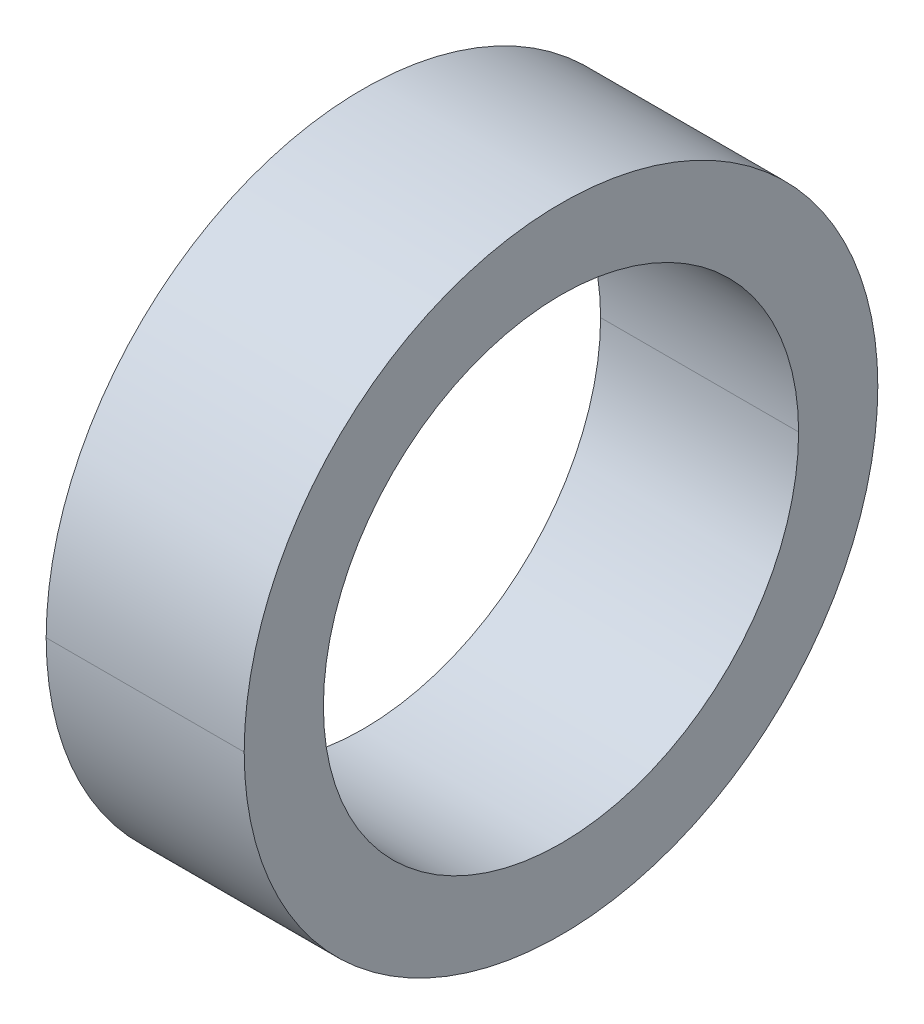
ISO-10303-21;
HEADER;
FILE_DESCRIPTION(('STEP AP214'),'2;1');
FILE_NAME('part.step','',(''),(''),'','','');
FILE_SCHEMA(('AUTOMOTIVE_DESIGN { 1 0 10303 214 1 1 1 1 }'));
ENDSEC;
DATA;
#1=APPLICATION_CONTEXT('core data for automotive mechanical design processes');
#2=APPLICATION_PROTOCOL_DEFINITION('international standard','automotive_design',2000,#1);
#3=PRODUCT_CONTEXT('',#1,'mechanical');
#4=PRODUCT('Part','Part','',(#3));
#5=PRODUCT_RELATED_PRODUCT_CATEGORY('part','',(#4));
#6=PRODUCT_DEFINITION_FORMATION('','',#4);
#7=PRODUCT_DEFINITION_CONTEXT('part definition',#1,'design');
#8=PRODUCT_DEFINITION('design','',#6,#7);
#9=PRODUCT_DEFINITION_SHAPE('','',#8);
#10=(LENGTH_UNIT() NAMED_UNIT(*) SI_UNIT(.MILLI.,.METRE.));
#11=(NAMED_UNIT(*) PLANE_ANGLE_UNIT() SI_UNIT($,.RADIAN.));
#12=(NAMED_UNIT(*) SI_UNIT($,.STERADIAN.) SOLID_ANGLE_UNIT());
#13=UNCERTAINTY_MEASURE_WITH_UNIT(LENGTH_MEASURE(1.E-05),#10,'distance_accuracy_value','');
#14=(GEOMETRIC_REPRESENTATION_CONTEXT(3) GLOBAL_UNCERTAINTY_ASSIGNED_CONTEXT((#13)) GLOBAL_UNIT_ASSIGNED_CONTEXT((#10,
#11,#12)) REPRESENTATION_CONTEXT('',''));
#15=CARTESIAN_POINT('',(0.,0.,0.));
#16=DIRECTION('',(0.,0.,1.));
#17=DIRECTION('',(1.,0.,0.));
#18=AXIS2_PLACEMENT_3D('',#15,#16,#17);
#19=CARTESIAN_POINT('',(1.25,0.,0.));
#20=DIRECTION('',(-1.,0.,0.));
#21=DIRECTION('',(0.,0.,1.));
#22=AXIS2_PLACEMENT_3D('',#19,#20,#21);
#23=CYLINDRICAL_SURFACE('',#22,3.);
#24=DIRECTION('',(-1.,0.,0.));
#25=VECTOR('',#24,1.);
#26=CARTESIAN_POINT('',(1.25,0.,-3.));
#27=LINE('',#26,#25);
#28=CARTESIAN_POINT('',(1.25,0.,-3.));
#29=VERTEX_POINT('',#28);
#30=CARTESIAN_POINT('',(-1.25,0.,-3.));
#31=VERTEX_POINT('',#30);
#32=EDGE_CURVE('E87',#29,#31,#27,.T.);
#33=ORIENTED_EDGE('',*,*,#32,.F.);
#34=CARTESIAN_POINT('',(1.25,0.,0.));
#35=DIRECTION('',(1.,0.,0.));
#36=DIRECTION('',(0.,0.,-1.));
#37=AXIS2_PLACEMENT_3D('',#34,#35,#36);
#38=CIRCLE('',#37,3.);
#39=CARTESIAN_POINT('',(1.25,0.,3.));
#40=VERTEX_POINT('',#39);
#41=EDGE_CURVE('E80',#29,#40,#38,.T.);
#42=ORIENTED_EDGE('',*,*,#41,.T.);
#43=DIRECTION('',(-1.,0.,0.));
#44=VECTOR('',#43,1.);
#45=CARTESIAN_POINT('',(1.25,0.,3.));
#46=LINE('',#45,#44);
#47=CARTESIAN_POINT('',(-1.25,0.,3.));
#48=VERTEX_POINT('',#47);
#49=EDGE_CURVE('E79',#40,#48,#46,.T.);
#50=ORIENTED_EDGE('',*,*,#49,.T.);
#51=CARTESIAN_POINT('',(-1.25,0.,0.));
#52=DIRECTION('',(1.,0.,0.));
#53=DIRECTION('',(0.,0.,-1.));
#54=AXIS2_PLACEMENT_3D('',#51,#52,#53);
#55=CIRCLE('',#54,3.);
#56=EDGE_CURVE('E11',#31,#48,#55,.T.);
#57=ORIENTED_EDGE('',*,*,#56,.F.);
#58=EDGE_LOOP('',(#33,#42,#50,#57));
#59=FACE_BOUND('',#58,.T.);
#60=ADVANCED_FACE('F16',(#59),#23,.F.);
#61=CARTESIAN_POINT('',(1.25,0.,0.));
#62=DIRECTION('',(-1.,0.,0.));
#63=DIRECTION('',(0.,0.,1.));
#64=AXIS2_PLACEMENT_3D('',#61,#62,#63);
#65=CYLINDRICAL_SURFACE('',#64,4.);
#66=DIRECTION('',(-1.,0.,0.));
#67=VECTOR('',#66,1.);
#68=CARTESIAN_POINT('',(1.25,0.,-4.));
#69=LINE('',#68,#67);
#70=CARTESIAN_POINT('',(1.25,0.,-4.));
#71=VERTEX_POINT('',#70);
#72=CARTESIAN_POINT('',(-1.25,0.,-4.));
#73=VERTEX_POINT('',#72);
#74=EDGE_CURVE('E102',#71,#73,#69,.T.);
#75=ORIENTED_EDGE('',*,*,#74,.F.);
#76=CARTESIAN_POINT('',(1.25,0.,0.));
#77=DIRECTION('',(1.,0.,0.));
#78=DIRECTION('',(0.,0.,-1.));
#79=AXIS2_PLACEMENT_3D('',#76,#77,#78);
#80=CIRCLE('',#79,4.);
#81=CARTESIAN_POINT('',(1.25,0.,4.));
#82=VERTEX_POINT('',#81);
#83=EDGE_CURVE('E63',#82,#71,#80,.T.);
#84=ORIENTED_EDGE('',*,*,#83,.F.);
#85=DIRECTION('',(-1.,0.,0.));
#86=VECTOR('',#85,1.);
#87=CARTESIAN_POINT('',(1.25,0.,4.));
#88=LINE('',#87,#86);
#89=CARTESIAN_POINT('',(-1.25,0.,4.));
#90=VERTEX_POINT('',#89);
#91=EDGE_CURVE('E101',#82,#90,#88,.T.);
#92=ORIENTED_EDGE('',*,*,#91,.T.);
#93=CARTESIAN_POINT('',(-1.25,0.,0.));
#94=DIRECTION('',(1.,0.,0.));
#95=DIRECTION('',(0.,0.,-1.));
#96=AXIS2_PLACEMENT_3D('',#93,#94,#95);
#97=CIRCLE('',#96,4.);
#98=EDGE_CURVE('E27',#90,#73,#97,.T.);
#99=ORIENTED_EDGE('',*,*,#98,.T.);
#100=EDGE_LOOP('',(#75,#84,#92,#99));
#101=FACE_BOUND('',#100,.T.);
#102=ADVANCED_FACE('F114',(#101),#65,.T.);
#103=CARTESIAN_POINT('',(-1.25,0.,0.));
#104=DIRECTION('',(1.,0.,0.));
#105=DIRECTION('',(0.,1.,0.));
#106=AXIS2_PLACEMENT_3D('',#103,#104,#105);
#107=PLANE('',#106);
#108=CARTESIAN_POINT('',(-1.25,0.,0.));
#109=DIRECTION('',(1.,0.,0.));
#110=DIRECTION('',(0.,0.,-1.));
#111=AXIS2_PLACEMENT_3D('',#108,#109,#110);
#112=CIRCLE('',#111,3.);
#113=EDGE_CURVE('E73',#48,#31,#112,.T.);
#114=ORIENTED_EDGE('',*,*,#113,.T.);
#115=ORIENTED_EDGE('',*,*,#56,.T.);
#116=EDGE_LOOP('',(#114,#115));
#117=FACE_BOUND('',#116,.T.);
#118=ORIENTED_EDGE('',*,*,#98,.F.);
#119=CARTESIAN_POINT('',(-1.25,0.,0.));
#120=DIRECTION('',(1.,0.,0.));
#121=DIRECTION('',(0.,0.,-1.));
#122=AXIS2_PLACEMENT_3D('',#119,#120,#121);
#123=CIRCLE('',#122,4.);
#124=EDGE_CURVE('E97',#73,#90,#123,.T.);
#125=ORIENTED_EDGE('',*,*,#124,.F.);
#126=EDGE_LOOP('',(#118,#125));
#127=FACE_BOUND('',#126,.T.);
#128=ADVANCED_FACE('F71',(#117,#127),#107,.F.);
#129=CARTESIAN_POINT('',(1.25,0.,0.));
#130=DIRECTION('',(1.,0.,0.));
#131=DIRECTION('',(0.,1.,0.));
#132=AXIS2_PLACEMENT_3D('',#129,#130,#131);
#133=PLANE('',#132);
#134=CARTESIAN_POINT('',(1.25,0.,0.));
#135=DIRECTION('',(1.,0.,0.));
#136=DIRECTION('',(0.,0.,-1.));
#137=AXIS2_PLACEMENT_3D('',#134,#135,#136);
#138=CIRCLE('',#137,3.);
#139=EDGE_CURVE('E20',#40,#29,#138,.T.);
#140=ORIENTED_EDGE('',*,*,#139,.F.);
#141=ORIENTED_EDGE('',*,*,#41,.F.);
#142=EDGE_LOOP('',(#140,#141));
#143=FACE_BOUND('',#142,.T.);
#144=ORIENTED_EDGE('',*,*,#83,.T.);
#145=CARTESIAN_POINT('',(1.25,0.,0.));
#146=DIRECTION('',(1.,0.,0.));
#147=DIRECTION('',(0.,0.,-1.));
#148=AXIS2_PLACEMENT_3D('',#145,#146,#147);
#149=CIRCLE('',#148,4.);
#150=EDGE_CURVE('E85',#71,#82,#149,.T.);
#151=ORIENTED_EDGE('',*,*,#150,.T.);
#152=EDGE_LOOP('',(#144,#151));
#153=FACE_BOUND('',#152,.T.);
#154=ADVANCED_FACE('F118',(#143,#153),#133,.T.);
#155=CARTESIAN_POINT('',(1.25,0.,0.));
#156=DIRECTION('',(-1.,0.,0.));
#157=DIRECTION('',(0.,0.,1.));
#158=AXIS2_PLACEMENT_3D('',#155,#156,#157);
#159=CYLINDRICAL_SURFACE('',#158,4.);
#160=ORIENTED_EDGE('',*,*,#150,.F.);
#161=ORIENTED_EDGE('',*,*,#74,.T.);
#162=ORIENTED_EDGE('',*,*,#124,.T.);
#163=ORIENTED_EDGE('',*,*,#91,.F.);
#164=EDGE_LOOP('',(#160,#161,#162,#163));
#165=FACE_BOUND('',#164,.T.);
#166=ADVANCED_FACE('F111',(#165),#159,.T.);
#167=CARTESIAN_POINT('',(1.25,0.,0.));
#168=DIRECTION('',(-1.,0.,0.));
#169=DIRECTION('',(0.,0.,1.));
#170=AXIS2_PLACEMENT_3D('',#167,#168,#169);
#171=CYLINDRICAL_SURFACE('',#170,3.);
#172=ORIENTED_EDGE('',*,*,#139,.T.);
#173=ORIENTED_EDGE('',*,*,#32,.T.);
#174=ORIENTED_EDGE('',*,*,#113,.F.);
#175=ORIENTED_EDGE('',*,*,#49,.F.);
#176=EDGE_LOOP('',(#172,#173,#174,#175));
#177=FACE_BOUND('',#176,.T.);
#178=ADVANCED_FACE('F18',(#177),#171,.F.);
#179=CLOSED_SHELL('',(#60,#102,#128,#154,#166,#178));
#180=MANIFOLD_SOLID_BREP('B1',#179);
#181=ADVANCED_BREP_SHAPE_REPRESENTATION('',(#18,#180),#14);
#182=SHAPE_DEFINITION_REPRESENTATION(#9,#181);
ENDSEC;
END-ISO-10303-21;
